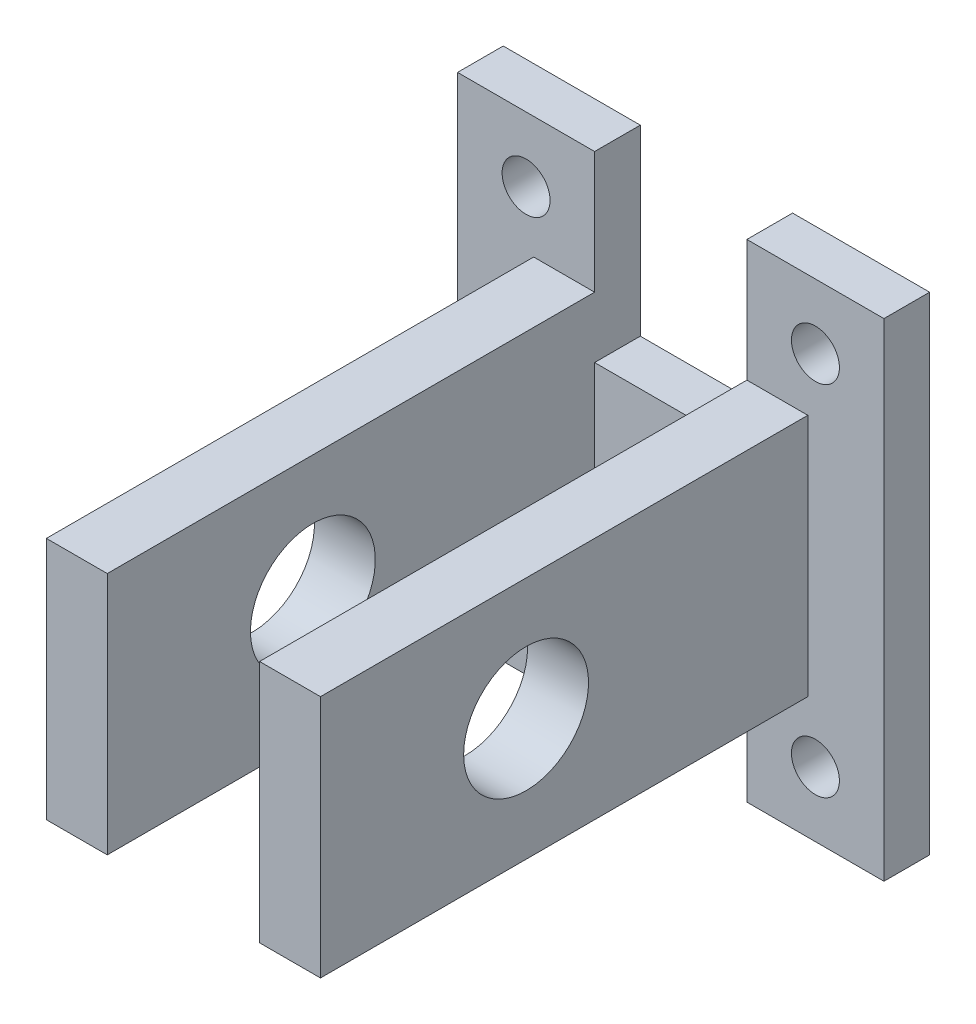
ISO-10303-21;
HEADER;
FILE_DESCRIPTION(('STEP AP214'),'2;1');
FILE_NAME('part.step','',(''),(''),'','','');
FILE_SCHEMA(('AUTOMOTIVE_DESIGN { 1 0 10303 214 1 1 1 1 }'));
ENDSEC;
DATA;
#1=APPLICATION_CONTEXT('core data for automotive mechanical design processes');
#2=APPLICATION_PROTOCOL_DEFINITION('international standard','automotive_design',2000,#1);
#3=PRODUCT_CONTEXT('',#1,'mechanical');
#4=PRODUCT('Part','Part','',(#3));
#5=PRODUCT_RELATED_PRODUCT_CATEGORY('part','',(#4));
#6=PRODUCT_DEFINITION_FORMATION('','',#4);
#7=PRODUCT_DEFINITION_CONTEXT('part definition',#1,'design');
#8=PRODUCT_DEFINITION('design','',#6,#7);
#9=PRODUCT_DEFINITION_SHAPE('','',#8);
#10=(LENGTH_UNIT() NAMED_UNIT(*) SI_UNIT(.MILLI.,.METRE.));
#11=(NAMED_UNIT(*) PLANE_ANGLE_UNIT() SI_UNIT($,.RADIAN.));
#12=(NAMED_UNIT(*) SI_UNIT($,.STERADIAN.) SOLID_ANGLE_UNIT());
#13=UNCERTAINTY_MEASURE_WITH_UNIT(LENGTH_MEASURE(1.E-05),#10,'distance_accuracy_value','');
#14=(GEOMETRIC_REPRESENTATION_CONTEXT(3) GLOBAL_UNCERTAINTY_ASSIGNED_CONTEXT((#13)) GLOBAL_UNIT_ASSIGNED_CONTEXT((#10,
#11,#12)) REPRESENTATION_CONTEXT('',''));
#15=CARTESIAN_POINT('',(0.,0.,0.));
#16=DIRECTION('',(0.,0.,1.));
#17=DIRECTION('',(1.,0.,0.));
#18=AXIS2_PLACEMENT_3D('',#15,#16,#17);
#19=CARTESIAN_POINT('',(0.,0.,3.));
#20=DIRECTION('',(0.,0.,-1.));
#21=DIRECTION('',(-1.,0.,0.));
#22=AXIS2_PLACEMENT_3D('',#19,#20,#21);
#23=PLANE('',#22);
#24=DIRECTION('',(0.,-1.,0.));
#25=VECTOR('',#24,1.);
#26=CARTESIAN_POINT('',(19.,8.,3.));
#27=LINE('',#26,#25);
#28=CARTESIAN_POINT('',(19.,20.,3.));
#29=VERTEX_POINT('',#28);
#30=CARTESIAN_POINT('',(19.,12.,3.));
#31=VERTEX_POINT('',#30);
#32=EDGE_CURVE('E358',#29,#31,#27,.T.);
#33=ORIENTED_EDGE('',*,*,#32,.F.);
#34=DIRECTION('',(-1.,0.,0.));
#35=VECTOR('',#34,1.);
#36=CARTESIAN_POINT('',(9.,20.,3.));
#37=LINE('',#36,#35);
#38=CARTESIAN_POINT('',(9.,20.,3.));
#39=VERTEX_POINT('',#38);
#40=EDGE_CURVE('E271',#29,#39,#37,.T.);
#41=ORIENTED_EDGE('',*,*,#40,.T.);
#42=DIRECTION('',(0.,1.,0.));
#43=VECTOR('',#42,1.);
#44=CARTESIAN_POINT('',(9.,8.,3.));
#45=LINE('',#44,#43);
#46=CARTESIAN_POINT('',(9.,12.,3.));
#47=VERTEX_POINT('',#46);
#48=EDGE_CURVE('E11',#47,#39,#45,.T.);
#49=ORIENTED_EDGE('',*,*,#48,.F.);
#50=DIRECTION('',(1.,0.,0.));
#51=VECTOR('',#50,1.);
#52=CARTESIAN_POINT('',(19.,12.,3.));
#53=LINE('',#52,#51);
#54=EDGE_CURVE('E260',#47,#31,#53,.T.);
#55=ORIENTED_EDGE('',*,*,#54,.T.);
#56=EDGE_LOOP('',(#33,#41,#49,#55));
#57=FACE_BOUND('',#56,.T.);
#58=ADVANCED_FACE('F33',(#57),#23,.F.);
#59=CARTESIAN_POINT('',(23.5,4.25,3.));
#60=DIRECTION('',(0.,0.,1.));
#61=DIRECTION('',(-1.,0.,0.));
#62=AXIS2_PLACEMENT_3D('',#59,#60,#61);
#63=CIRCLE('',#62,1.57500000000001);
#64=CARTESIAN_POINT('',(21.925,4.25,3.));
#65=VERTEX_POINT('',#64);
#66=EDGE_CURVE('E236',#65,#65,#63,.T.);
#67=ORIENTED_EDGE('',*,*,#66,.F.);
#68=EDGE_LOOP('',(#67));
#69=FACE_BOUND('',#68,.T.);
#70=CARTESIAN_POINT('',(23.5,27.75,3.));
#71=DIRECTION('',(0.,0.,1.));
#72=DIRECTION('',(-1.,0.,0.));
#73=AXIS2_PLACEMENT_3D('',#70,#71,#72);
#74=CIRCLE('',#73,1.575);
#75=CARTESIAN_POINT('',(21.925,27.75,3.));
#76=VERTEX_POINT('',#75);
#77=EDGE_CURVE('E230',#76,#76,#74,.T.);
#78=ORIENTED_EDGE('',*,*,#77,.F.);
#79=EDGE_LOOP('',(#78));
#80=FACE_BOUND('',#79,.T.);
#81=DIRECTION('',(1.,0.,0.));
#82=VECTOR('',#81,1.);
#83=CARTESIAN_POINT('',(23.,8.,3.));
#84=LINE('',#83,#82);
#85=CARTESIAN_POINT('',(19.,8.,3.));
#86=VERTEX_POINT('',#85);
#87=CARTESIAN_POINT('',(23.,8.,3.));
#88=VERTEX_POINT('',#87);
#89=EDGE_CURVE('E360',#86,#88,#84,.T.);
#90=ORIENTED_EDGE('',*,*,#89,.F.);
#91=DIRECTION('',(0.,-1.,0.));
#92=VECTOR('',#91,1.);
#93=CARTESIAN_POINT('',(19.,0.,3.));
#94=LINE('',#93,#92);
#95=CARTESIAN_POINT('',(19.,0.,3.));
#96=VERTEX_POINT('',#95);
#97=EDGE_CURVE('E193',#86,#96,#94,.T.);
#98=ORIENTED_EDGE('',*,*,#97,.T.);
#99=DIRECTION('',(1.,0.,0.));
#100=VECTOR('',#99,1.);
#101=CARTESIAN_POINT('',(28.,0.,3.));
#102=LINE('',#101,#100);
#103=CARTESIAN_POINT('',(28.,0.,3.));
#104=VERTEX_POINT('',#103);
#105=EDGE_CURVE('E263',#96,#104,#102,.T.);
#106=ORIENTED_EDGE('',*,*,#105,.T.);
#107=DIRECTION('',(0.,1.,0.));
#108=VECTOR('',#107,1.);
#109=CARTESIAN_POINT('',(28.,32.,3.));
#110=LINE('',#109,#108);
#111=CARTESIAN_POINT('',(28.,32.,3.));
#112=VERTEX_POINT('',#111);
#113=EDGE_CURVE('E265',#104,#112,#110,.T.);
#114=ORIENTED_EDGE('',*,*,#113,.T.);
#115=DIRECTION('',(-1.,0.,0.));
#116=VECTOR('',#115,1.);
#117=CARTESIAN_POINT('',(19.,32.,3.));
#118=LINE('',#117,#116);
#119=CARTESIAN_POINT('',(19.,32.,3.));
#120=VERTEX_POINT('',#119);
#121=EDGE_CURVE('E267',#112,#120,#118,.T.);
#122=ORIENTED_EDGE('',*,*,#121,.T.);
#123=DIRECTION('',(0.,-1.,0.));
#124=VECTOR('',#123,1.);
#125=CARTESIAN_POINT('',(19.,20.,3.));
#126=LINE('',#125,#124);
#127=CARTESIAN_POINT('',(19.,24.,3.));
#128=VERTEX_POINT('',#127);
#129=EDGE_CURVE('E269',#120,#128,#126,.T.);
#130=ORIENTED_EDGE('',*,*,#129,.T.);
#131=DIRECTION('',(-1.,0.,0.));
#132=VECTOR('',#131,1.);
#133=CARTESIAN_POINT('',(19.,24.,3.));
#134=LINE('',#133,#132);
#135=CARTESIAN_POINT('',(23.,24.,3.));
#136=VERTEX_POINT('',#135);
#137=EDGE_CURVE('E55',#136,#128,#134,.T.);
#138=ORIENTED_EDGE('',*,*,#137,.F.);
#139=DIRECTION('',(0.,1.,0.));
#140=VECTOR('',#139,1.);
#141=CARTESIAN_POINT('',(23.,24.,3.));
#142=LINE('',#141,#140);
#143=EDGE_CURVE('E50',#88,#136,#142,.T.);
#144=ORIENTED_EDGE('',*,*,#143,.F.);
#145=EDGE_LOOP('',(#90,#98,#106,#114,#122,#130,#138,#144));
#146=FACE_BOUND('',#145,.T.);
#147=ADVANCED_FACE('F411',(#69,#80,#146),#23,.F.);
#148=CARTESIAN_POINT('',(4.5,4.25,3.));
#149=DIRECTION('',(0.,0.,1.));
#150=DIRECTION('',(1.,0.,0.));
#151=AXIS2_PLACEMENT_3D('',#148,#149,#150);
#152=CIRCLE('',#151,1.575);
#153=CARTESIAN_POINT('',(6.075,4.25,3.));
#154=VERTEX_POINT('',#153);
#155=EDGE_CURVE('E242',#154,#154,#152,.T.);
#156=ORIENTED_EDGE('',*,*,#155,.F.);
#157=EDGE_LOOP('',(#156));
#158=FACE_BOUND('',#157,.T.);
#159=CARTESIAN_POINT('',(4.5,27.75,3.));
#160=DIRECTION('',(0.,0.,1.));
#161=DIRECTION('',(1.,0.,0.));
#162=AXIS2_PLACEMENT_3D('',#159,#160,#161);
#163=CIRCLE('',#162,1.575);
#164=CARTESIAN_POINT('',(6.075,27.75,3.));
#165=VERTEX_POINT('',#164);
#166=EDGE_CURVE('E248',#165,#165,#163,.T.);
#167=ORIENTED_EDGE('',*,*,#166,.F.);
#168=EDGE_LOOP('',(#167));
#169=FACE_BOUND('',#168,.T.);
#170=DIRECTION('',(1.,0.,0.));
#171=VECTOR('',#170,1.);
#172=CARTESIAN_POINT('',(5.,8.,3.));
#173=LINE('',#172,#171);
#174=CARTESIAN_POINT('',(5.,8.,3.));
#175=VERTEX_POINT('',#174);
#176=CARTESIAN_POINT('',(9.,8.,3.));
#177=VERTEX_POINT('',#176);
#178=EDGE_CURVE('E207',#175,#177,#173,.T.);
#179=ORIENTED_EDGE('',*,*,#178,.F.);
#180=DIRECTION('',(0.,-1.,0.));
#181=VECTOR('',#180,1.);
#182=CARTESIAN_POINT('',(5.,24.,3.));
#183=LINE('',#182,#181);
#184=CARTESIAN_POINT('',(5.,24.,3.));
#185=VERTEX_POINT('',#184);
#186=EDGE_CURVE('E197',#185,#175,#183,.T.);
#187=ORIENTED_EDGE('',*,*,#186,.F.);
#188=DIRECTION('',(-1.,0.,0.));
#189=VECTOR('',#188,1.);
#190=CARTESIAN_POINT('',(9.,24.,3.));
#191=LINE('',#190,#189);
#192=CARTESIAN_POINT('',(9.,24.,3.));
#193=VERTEX_POINT('',#192);
#194=EDGE_CURVE('E194',#193,#185,#191,.T.);
#195=ORIENTED_EDGE('',*,*,#194,.F.);
#196=DIRECTION('',(0.,1.,0.));
#197=VECTOR('',#196,1.);
#198=CARTESIAN_POINT('',(9.,32.,3.));
#199=LINE('',#198,#197);
#200=CARTESIAN_POINT('',(9.,32.,3.));
#201=VERTEX_POINT('',#200);
#202=EDGE_CURVE('E273',#193,#201,#199,.T.);
#203=ORIENTED_EDGE('',*,*,#202,.T.);
#204=DIRECTION('',(-1.,0.,0.));
#205=VECTOR('',#204,1.);
#206=CARTESIAN_POINT('',(0.,32.,3.));
#207=LINE('',#206,#205);
#208=CARTESIAN_POINT('',(0.,32.,3.));
#209=VERTEX_POINT('',#208);
#210=EDGE_CURVE('E275',#201,#209,#207,.T.);
#211=ORIENTED_EDGE('',*,*,#210,.T.);
#212=DIRECTION('',(0.,-1.,0.));
#213=VECTOR('',#212,1.);
#214=CARTESIAN_POINT('',(0.,0.,3.));
#215=LINE('',#214,#213);
#216=CARTESIAN_POINT('',(0.,0.,3.));
#217=VERTEX_POINT('',#216);
#218=EDGE_CURVE('E277',#209,#217,#215,.T.);
#219=ORIENTED_EDGE('',*,*,#218,.T.);
#220=DIRECTION('',(1.,0.,0.));
#221=VECTOR('',#220,1.);
#222=CARTESIAN_POINT('',(8.99999999999999,0.,3.));
#223=LINE('',#222,#221);
#224=CARTESIAN_POINT('',(8.99999999999999,0.,3.));
#225=VERTEX_POINT('',#224);
#226=EDGE_CURVE('E254',#217,#225,#223,.T.);
#227=ORIENTED_EDGE('',*,*,#226,.T.);
#228=DIRECTION('',(0.,1.,0.));
#229=VECTOR('',#228,1.);
#230=CARTESIAN_POINT('',(9.,12.,3.));
#231=LINE('',#230,#229);
#232=EDGE_CURVE('E257',#225,#177,#231,.T.);
#233=ORIENTED_EDGE('',*,*,#232,.T.);
#234=EDGE_LOOP('',(#179,#187,#195,#203,#211,#219,#227,#233));
#235=FACE_BOUND('',#234,.T.);
#236=ADVANCED_FACE('F413',(#158,#169,#235),#23,.F.);
#237=CARTESIAN_POINT('',(0.,0.,0.));
#238=DIRECTION('',(0.,0.,-1.));
#239=DIRECTION('',(-1.,0.,0.));
#240=AXIS2_PLACEMENT_3D('',#237,#238,#239);
#241=PLANE('',#240);
#242=CARTESIAN_POINT('',(23.5,4.25,0.));
#243=DIRECTION('',(0.,0.,1.));
#244=DIRECTION('',(-1.,0.,0.));
#245=AXIS2_PLACEMENT_3D('',#242,#243,#244);
#246=CIRCLE('',#245,1.57500000000001);
#247=CARTESIAN_POINT('',(21.925,4.25,0.));
#248=VERTEX_POINT('',#247);
#249=EDGE_CURVE('E233',#248,#248,#246,.T.);
#250=ORIENTED_EDGE('',*,*,#249,.T.);
#251=EDGE_LOOP('',(#250));
#252=FACE_BOUND('',#251,.T.);
#253=CARTESIAN_POINT('',(4.5,27.75,0.));
#254=DIRECTION('',(0.,0.,1.));
#255=DIRECTION('',(1.,0.,0.));
#256=AXIS2_PLACEMENT_3D('',#253,#254,#255);
#257=CIRCLE('',#256,1.575);
#258=CARTESIAN_POINT('',(6.075,27.75,0.));
#259=VERTEX_POINT('',#258);
#260=EDGE_CURVE('E245',#259,#259,#257,.T.);
#261=ORIENTED_EDGE('',*,*,#260,.T.);
#262=EDGE_LOOP('',(#261));
#263=FACE_BOUND('',#262,.T.);
#264=DIRECTION('',(1.,0.,0.));
#265=VECTOR('',#264,1.);
#266=CARTESIAN_POINT('',(8.99999999999999,0.,0.));
#267=LINE('',#266,#265);
#268=CARTESIAN_POINT('',(0.,0.,0.));
#269=VERTEX_POINT('',#268);
#270=CARTESIAN_POINT('',(8.99999999999999,0.,0.));
#271=VERTEX_POINT('',#270);
#272=EDGE_CURVE('E251',#269,#271,#267,.T.);
#273=ORIENTED_EDGE('',*,*,#272,.F.);
#274=DIRECTION('',(0.,-1.,0.));
#275=VECTOR('',#274,1.);
#276=CARTESIAN_POINT('',(0.,0.,0.));
#277=LINE('',#276,#275);
#278=CARTESIAN_POINT('',(0.,32.,0.));
#279=VERTEX_POINT('',#278);
#280=EDGE_CURVE('E258',#279,#269,#277,.T.);
#281=ORIENTED_EDGE('',*,*,#280,.F.);
#282=DIRECTION('',(-1.,0.,0.));
#283=VECTOR('',#282,1.);
#284=CARTESIAN_POINT('',(0.,32.,0.));
#285=LINE('',#284,#283);
#286=CARTESIAN_POINT('',(9.,32.,0.));
#287=VERTEX_POINT('',#286);
#288=EDGE_CURVE('E300',#287,#279,#285,.T.);
#289=ORIENTED_EDGE('',*,*,#288,.F.);
#290=DIRECTION('',(0.,1.,0.));
#291=VECTOR('',#290,1.);
#292=CARTESIAN_POINT('',(9.,32.,0.));
#293=LINE('',#292,#291);
#294=CARTESIAN_POINT('',(9.,20.,0.));
#295=VERTEX_POINT('',#294);
#296=EDGE_CURVE('E298',#295,#287,#293,.T.);
#297=ORIENTED_EDGE('',*,*,#296,.F.);
#298=DIRECTION('',(-1.,0.,0.));
#299=VECTOR('',#298,1.);
#300=CARTESIAN_POINT('',(9.,20.,0.));
#301=LINE('',#300,#299);
#302=CARTESIAN_POINT('',(19.,20.,0.));
#303=VERTEX_POINT('',#302);
#304=EDGE_CURVE('E296',#303,#295,#301,.T.);
#305=ORIENTED_EDGE('',*,*,#304,.F.);
#306=DIRECTION('',(0.,-1.,0.));
#307=VECTOR('',#306,1.);
#308=CARTESIAN_POINT('',(19.,20.,0.));
#309=LINE('',#308,#307);
#310=CARTESIAN_POINT('',(19.,32.,0.));
#311=VERTEX_POINT('',#310);
#312=EDGE_CURVE('E294',#311,#303,#309,.T.);
#313=ORIENTED_EDGE('',*,*,#312,.F.);
#314=DIRECTION('',(-1.,0.,0.));
#315=VECTOR('',#314,1.);
#316=CARTESIAN_POINT('',(19.,32.,0.));
#317=LINE('',#316,#315);
#318=CARTESIAN_POINT('',(28.,32.,0.));
#319=VERTEX_POINT('',#318);
#320=EDGE_CURVE('E292',#319,#311,#317,.T.);
#321=ORIENTED_EDGE('',*,*,#320,.F.);
#322=DIRECTION('',(0.,1.,0.));
#323=VECTOR('',#322,1.);
#324=CARTESIAN_POINT('',(28.,32.,0.));
#325=LINE('',#324,#323);
#326=CARTESIAN_POINT('',(28.,0.,0.));
#327=VERTEX_POINT('',#326);
#328=EDGE_CURVE('E290',#327,#319,#325,.T.);
#329=ORIENTED_EDGE('',*,*,#328,.F.);
#330=DIRECTION('',(1.,0.,0.));
#331=VECTOR('',#330,1.);
#332=CARTESIAN_POINT('',(28.,0.,0.));
#333=LINE('',#332,#331);
#334=CARTESIAN_POINT('',(19.,0.,0.));
#335=VERTEX_POINT('',#334);
#336=EDGE_CURVE('E288',#335,#327,#333,.T.);
#337=ORIENTED_EDGE('',*,*,#336,.F.);
#338=DIRECTION('',(0.,-1.,0.));
#339=VECTOR('',#338,1.);
#340=CARTESIAN_POINT('',(19.,0.,0.));
#341=LINE('',#340,#339);
#342=CARTESIAN_POINT('',(19.,12.,0.));
#343=VERTEX_POINT('',#342);
#344=EDGE_CURVE('E286',#343,#335,#341,.T.);
#345=ORIENTED_EDGE('',*,*,#344,.F.);
#346=DIRECTION('',(1.,0.,0.));
#347=VECTOR('',#346,1.);
#348=CARTESIAN_POINT('',(19.,12.,0.));
#349=LINE('',#348,#347);
#350=CARTESIAN_POINT('',(9.,12.,0.));
#351=VERTEX_POINT('',#350);
#352=EDGE_CURVE('E284',#351,#343,#349,.T.);
#353=ORIENTED_EDGE('',*,*,#352,.F.);
#354=DIRECTION('',(0.,1.,0.));
#355=VECTOR('',#354,1.);
#356=CARTESIAN_POINT('',(9.,12.,0.));
#357=LINE('',#356,#355);
#358=EDGE_CURVE('E282',#271,#351,#357,.T.);
#359=ORIENTED_EDGE('',*,*,#358,.F.);
#360=EDGE_LOOP('',(#273,#281,#289,#297,#305,#313,#321,#329,#337,#345,#353,#359));
#361=FACE_BOUND('',#360,.T.);
#362=CARTESIAN_POINT('',(4.5,4.25,0.));
#363=DIRECTION('',(0.,0.,1.));
#364=DIRECTION('',(1.,0.,0.));
#365=AXIS2_PLACEMENT_3D('',#362,#363,#364);
#366=CIRCLE('',#365,1.575);
#367=CARTESIAN_POINT('',(6.075,4.25,0.));
#368=VERTEX_POINT('',#367);
#369=EDGE_CURVE('E239',#368,#368,#366,.T.);
#370=ORIENTED_EDGE('',*,*,#369,.T.);
#371=EDGE_LOOP('',(#370));
#372=FACE_BOUND('',#371,.T.);
#373=CARTESIAN_POINT('',(23.5,27.75,0.));
#374=DIRECTION('',(0.,0.,1.));
#375=DIRECTION('',(-1.,0.,0.));
#376=AXIS2_PLACEMENT_3D('',#373,#374,#375);
#377=CIRCLE('',#376,1.575);
#378=CARTESIAN_POINT('',(21.925,27.75,0.));
#379=VERTEX_POINT('',#378);
#380=EDGE_CURVE('E229',#379,#379,#377,.T.);
#381=ORIENTED_EDGE('',*,*,#380,.T.);
#382=EDGE_LOOP('',(#381));
#383=FACE_BOUND('',#382,.T.);
#384=ADVANCED_FACE('F345',(#252,#263,#361,#372,#383),#241,.T.);
#385=CARTESIAN_POINT('',(8.99999999999999,0.,3.));
#386=DIRECTION('',(0.,1.,0.));
#387=DIRECTION('',(-1.,0.,0.));
#388=AXIS2_PLACEMENT_3D('',#385,#386,#387);
#389=PLANE('',#388);
#390=ORIENTED_EDGE('',*,*,#272,.T.);
#391=DIRECTION('',(0.,0.,-1.));
#392=VECTOR('',#391,1.);
#393=CARTESIAN_POINT('',(8.99999999999999,0.,3.));
#394=LINE('',#393,#392);
#395=EDGE_CURVE('E42',#225,#271,#394,.T.);
#396=ORIENTED_EDGE('',*,*,#395,.F.);
#397=ORIENTED_EDGE('',*,*,#226,.F.);
#398=DIRECTION('',(0.,0.,-1.));
#399=VECTOR('',#398,1.);
#400=CARTESIAN_POINT('',(0.,0.,3.));
#401=LINE('',#400,#399);
#402=EDGE_CURVE('E279',#217,#269,#401,.T.);
#403=ORIENTED_EDGE('',*,*,#402,.T.);
#404=EDGE_LOOP('',(#390,#396,#397,#403));
#405=FACE_BOUND('',#404,.T.);
#406=ADVANCED_FACE('F35',(#405),#389,.F.);
#407=CARTESIAN_POINT('',(19.,12.,3.));
#408=DIRECTION('',(0.,1.,0.));
#409=DIRECTION('',(-1.,0.,0.));
#410=AXIS2_PLACEMENT_3D('',#407,#408,#409);
#411=PLANE('',#410);
#412=ORIENTED_EDGE('',*,*,#352,.T.);
#413=DIRECTION('',(0.,0.,-1.));
#414=VECTOR('',#413,1.);
#415=CARTESIAN_POINT('',(19.,12.,3.));
#416=LINE('',#415,#414);
#417=EDGE_CURVE('E329',#31,#343,#416,.T.);
#418=ORIENTED_EDGE('',*,*,#417,.F.);
#419=ORIENTED_EDGE('',*,*,#54,.F.);
#420=DIRECTION('',(0.,0.,-1.));
#421=VECTOR('',#420,1.);
#422=CARTESIAN_POINT('',(9.,12.,3.));
#423=LINE('',#422,#421);
#424=EDGE_CURVE('E332',#47,#351,#423,.T.);
#425=ORIENTED_EDGE('',*,*,#424,.T.);
#426=EDGE_LOOP('',(#412,#418,#419,#425));
#427=FACE_BOUND('',#426,.T.);
#428=ADVANCED_FACE('F353',(#427),#411,.F.);
#429=CARTESIAN_POINT('',(28.,0.,3.));
#430=DIRECTION('',(0.,1.,0.));
#431=DIRECTION('',(0.,0.,1.));
#432=AXIS2_PLACEMENT_3D('',#429,#430,#431);
#433=PLANE('',#432);
#434=ORIENTED_EDGE('',*,*,#336,.T.);
#435=DIRECTION('',(0.,0.,-1.));
#436=VECTOR('',#435,1.);
#437=CARTESIAN_POINT('',(28.,0.,3.));
#438=LINE('',#437,#436);
#439=EDGE_CURVE('E323',#104,#327,#438,.T.);
#440=ORIENTED_EDGE('',*,*,#439,.F.);
#441=ORIENTED_EDGE('',*,*,#105,.F.);
#442=DIRECTION('',(0.,0.,-1.));
#443=VECTOR('',#442,1.);
#444=CARTESIAN_POINT('',(19.,0.,3.));
#445=LINE('',#444,#443);
#446=EDGE_CURVE('E326',#96,#335,#445,.T.);
#447=ORIENTED_EDGE('',*,*,#446,.T.);
#448=EDGE_LOOP('',(#434,#440,#441,#447));
#449=FACE_BOUND('',#448,.T.);
#450=ADVANCED_FACE('F619',(#449),#433,.F.);
#451=CARTESIAN_POINT('',(28.,32.,3.));
#452=DIRECTION('',(-1.,0.,0.));
#453=DIRECTION('',(0.,-1.,0.));
#454=AXIS2_PLACEMENT_3D('',#451,#452,#453);
#455=PLANE('',#454);
#456=ORIENTED_EDGE('',*,*,#328,.T.);
#457=DIRECTION('',(0.,0.,-1.));
#458=VECTOR('',#457,1.);
#459=CARTESIAN_POINT('',(28.,32.,3.));
#460=LINE('',#459,#458);
#461=EDGE_CURVE('E320',#112,#319,#460,.T.);
#462=ORIENTED_EDGE('',*,*,#461,.F.);
#463=ORIENTED_EDGE('',*,*,#113,.F.);
#464=ORIENTED_EDGE('',*,*,#439,.T.);
#465=EDGE_LOOP('',(#456,#462,#463,#464));
#466=FACE_BOUND('',#465,.T.);
#467=ADVANCED_FACE('F407',(#466),#455,.F.);
#468=CARTESIAN_POINT('',(19.,32.,3.));
#469=DIRECTION('',(0.,-1.,0.));
#470=DIRECTION('',(0.,0.,-1.));
#471=AXIS2_PLACEMENT_3D('',#468,#469,#470);
#472=PLANE('',#471);
#473=ORIENTED_EDGE('',*,*,#320,.T.);
#474=DIRECTION('',(0.,0.,-1.));
#475=VECTOR('',#474,1.);
#476=CARTESIAN_POINT('',(19.,32.,3.));
#477=LINE('',#476,#475);
#478=EDGE_CURVE('E317',#120,#311,#477,.T.);
#479=ORIENTED_EDGE('',*,*,#478,.F.);
#480=ORIENTED_EDGE('',*,*,#121,.F.);
#481=ORIENTED_EDGE('',*,*,#461,.T.);
#482=EDGE_LOOP('',(#473,#479,#480,#481));
#483=FACE_BOUND('',#482,.T.);
#484=ADVANCED_FACE('F399',(#483),#472,.F.);
#485=CARTESIAN_POINT('',(19.,20.,3.));
#486=DIRECTION('',(1.,0.,0.));
#487=DIRECTION('',(0.,0.,-1.));
#488=AXIS2_PLACEMENT_3D('',#485,#486,#487);
#489=PLANE('',#488);
#490=CARTESIAN_POINT('',(19.,16.,21.5));
#491=DIRECTION('',(1.,0.,0.));
#492=DIRECTION('',(0.,0.,-1.));
#493=AXIS2_PLACEMENT_3D('',#490,#491,#492);
#494=CIRCLE('',#493,4.1);
#495=CARTESIAN_POINT('',(19.,16.,17.4));
#496=VERTEX_POINT('',#495);
#497=EDGE_CURVE('E361',#496,#496,#494,.T.);
#498=ORIENTED_EDGE('',*,*,#497,.T.);
#499=EDGE_LOOP('',(#498));
#500=FACE_BOUND('',#499,.T.);
#501=ORIENTED_EDGE('',*,*,#312,.T.);
#502=DIRECTION('',(0.,0.,-1.));
#503=VECTOR('',#502,1.);
#504=CARTESIAN_POINT('',(19.,20.,3.));
#505=LINE('',#504,#503);
#506=EDGE_CURVE('E314',#29,#303,#505,.T.);
#507=ORIENTED_EDGE('',*,*,#506,.F.);
#508=ORIENTED_EDGE('',*,*,#32,.T.);
#509=ORIENTED_EDGE('',*,*,#417,.T.);
#510=ORIENTED_EDGE('',*,*,#344,.T.);
#511=ORIENTED_EDGE('',*,*,#446,.F.);
#512=ORIENTED_EDGE('',*,*,#97,.F.);
#513=DIRECTION('',(0.,0.,-1.));
#514=VECTOR('',#513,1.);
#515=CARTESIAN_POINT('',(19.,8.,35.));
#516=LINE('',#515,#514);
#517=CARTESIAN_POINT('',(19.,8.,35.));
#518=VERTEX_POINT('',#517);
#519=EDGE_CURVE('E174',#518,#86,#516,.T.);
#520=ORIENTED_EDGE('',*,*,#519,.F.);
#521=DIRECTION('',(0.,-1.,0.));
#522=VECTOR('',#521,1.);
#523=CARTESIAN_POINT('',(19.,8.,35.));
#524=LINE('',#523,#522);
#525=CARTESIAN_POINT('',(19.,24.,35.));
#526=VERTEX_POINT('',#525);
#527=EDGE_CURVE('E180',#526,#518,#524,.T.);
#528=ORIENTED_EDGE('',*,*,#527,.F.);
#529=DIRECTION('',(0.,0.,-1.));
#530=VECTOR('',#529,1.);
#531=CARTESIAN_POINT('',(19.,24.,35.));
#532=LINE('',#531,#530);
#533=EDGE_CURVE('E372',#526,#128,#532,.T.);
#534=ORIENTED_EDGE('',*,*,#533,.T.);
#535=ORIENTED_EDGE('',*,*,#129,.F.);
#536=ORIENTED_EDGE('',*,*,#478,.T.);
#537=EDGE_LOOP('',(#501,#507,#508,#509,#510,#511,#512,#520,#528,#534,#535,#536));
#538=FACE_BOUND('',#537,.T.);
#539=ADVANCED_FACE('F191',(#500,#538),#489,.F.);
#540=CARTESIAN_POINT('',(9.,20.,3.));
#541=DIRECTION('',(0.,-1.,0.));
#542=DIRECTION('',(1.,0.,0.));
#543=AXIS2_PLACEMENT_3D('',#540,#541,#542);
#544=PLANE('',#543);
#545=ORIENTED_EDGE('',*,*,#304,.T.);
#546=DIRECTION('',(0.,0.,-1.));
#547=VECTOR('',#546,1.);
#548=CARTESIAN_POINT('',(9.,20.,3.));
#549=LINE('',#548,#547);
#550=EDGE_CURVE('E311',#39,#295,#549,.T.);
#551=ORIENTED_EDGE('',*,*,#550,.F.);
#552=ORIENTED_EDGE('',*,*,#40,.F.);
#553=ORIENTED_EDGE('',*,*,#506,.T.);
#554=EDGE_LOOP('',(#545,#551,#552,#553));
#555=FACE_BOUND('',#554,.T.);
#556=ADVANCED_FACE('F398',(#555),#544,.F.);
#557=CARTESIAN_POINT('',(9.,32.,3.));
#558=DIRECTION('',(-1.,0.,0.));
#559=DIRECTION('',(0.,0.,1.));
#560=AXIS2_PLACEMENT_3D('',#557,#558,#559);
#561=PLANE('',#560);
#562=CARTESIAN_POINT('',(9.,16.,21.5));
#563=DIRECTION('',(-1.,0.,0.));
#564=DIRECTION('',(0.,0.,1.));
#565=AXIS2_PLACEMENT_3D('',#562,#563,#564);
#566=CIRCLE('',#565,4.1);
#567=CARTESIAN_POINT('',(9.,16.,25.6));
#568=VERTEX_POINT('',#567);
#569=EDGE_CURVE('E365',#568,#568,#566,.T.);
#570=ORIENTED_EDGE('',*,*,#569,.T.);
#571=EDGE_LOOP('',(#570));
#572=FACE_BOUND('',#571,.T.);
#573=ORIENTED_EDGE('',*,*,#296,.T.);
#574=DIRECTION('',(0.,0.,-1.));
#575=VECTOR('',#574,1.);
#576=CARTESIAN_POINT('',(9.,32.,3.));
#577=LINE('',#576,#575);
#578=EDGE_CURVE('E308',#201,#287,#577,.T.);
#579=ORIENTED_EDGE('',*,*,#578,.F.);
#580=ORIENTED_EDGE('',*,*,#202,.F.);
#581=DIRECTION('',(0.,0.,-1.));
#582=VECTOR('',#581,1.);
#583=CARTESIAN_POINT('',(9.,24.,35.));
#584=LINE('',#583,#582);
#585=CARTESIAN_POINT('',(9.,24.,35.));
#586=VERTEX_POINT('',#585);
#587=EDGE_CURVE('E226',#586,#193,#584,.T.);
#588=ORIENTED_EDGE('',*,*,#587,.F.);
#589=DIRECTION('',(0.,1.,0.));
#590=VECTOR('',#589,1.);
#591=CARTESIAN_POINT('',(9.,8.,35.));
#592=LINE('',#591,#590);
#593=CARTESIAN_POINT('',(9.,8.,35.));
#594=VERTEX_POINT('',#593);
#595=EDGE_CURVE('E203',#594,#586,#592,.T.);
#596=ORIENTED_EDGE('',*,*,#595,.F.);
#597=DIRECTION('',(0.,0.,-1.));
#598=VECTOR('',#597,1.);
#599=CARTESIAN_POINT('',(9.,8.,35.));
#600=LINE('',#599,#598);
#601=EDGE_CURVE('E212',#594,#177,#600,.T.);
#602=ORIENTED_EDGE('',*,*,#601,.T.);
#603=ORIENTED_EDGE('',*,*,#232,.F.);
#604=ORIENTED_EDGE('',*,*,#395,.T.);
#605=ORIENTED_EDGE('',*,*,#358,.T.);
#606=ORIENTED_EDGE('',*,*,#424,.F.);
#607=ORIENTED_EDGE('',*,*,#48,.T.);
#608=ORIENTED_EDGE('',*,*,#550,.T.);
#609=EDGE_LOOP('',(#573,#579,#580,#588,#596,#602,#603,#604,#605,#606,#607,#608));
#610=FACE_BOUND('',#609,.T.);
#611=ADVANCED_FACE('F337',(#572,#610),#561,.F.);
#612=CARTESIAN_POINT('',(0.,32.,3.));
#613=DIRECTION('',(0.,-1.,0.));
#614=DIRECTION('',(0.,0.,-1.));
#615=AXIS2_PLACEMENT_3D('',#612,#613,#614);
#616=PLANE('',#615);
#617=ORIENTED_EDGE('',*,*,#288,.T.);
#618=DIRECTION('',(0.,0.,-1.));
#619=VECTOR('',#618,1.);
#620=CARTESIAN_POINT('',(0.,32.,3.));
#621=LINE('',#620,#619);
#622=EDGE_CURVE('E305',#209,#279,#621,.T.);
#623=ORIENTED_EDGE('',*,*,#622,.F.);
#624=ORIENTED_EDGE('',*,*,#210,.F.);
#625=ORIENTED_EDGE('',*,*,#578,.T.);
#626=EDGE_LOOP('',(#617,#623,#624,#625));
#627=FACE_BOUND('',#626,.T.);
#628=ADVANCED_FACE('F451',(#627),#616,.F.);
#629=CARTESIAN_POINT('',(0.,0.,3.));
#630=DIRECTION('',(1.,0.,0.));
#631=DIRECTION('',(0.,0.,-1.));
#632=AXIS2_PLACEMENT_3D('',#629,#630,#631);
#633=PLANE('',#632);
#634=ORIENTED_EDGE('',*,*,#280,.T.);
#635=ORIENTED_EDGE('',*,*,#402,.F.);
#636=ORIENTED_EDGE('',*,*,#218,.F.);
#637=ORIENTED_EDGE('',*,*,#622,.T.);
#638=EDGE_LOOP('',(#634,#635,#636,#637));
#639=FACE_BOUND('',#638,.T.);
#640=ADVANCED_FACE('F454',(#639),#633,.F.);
#641=CARTESIAN_POINT('',(4.5,27.75,3.));
#642=DIRECTION('',(0.,0.,-1.));
#643=DIRECTION('',(-1.,0.,0.));
#644=AXIS2_PLACEMENT_3D('',#641,#642,#643);
#645=CYLINDRICAL_SURFACE('',#644,1.575);
#646=ORIENTED_EDGE('',*,*,#166,.T.);
#647=EDGE_LOOP('',(#646));
#648=FACE_BOUND('',#647,.T.);
#649=ORIENTED_EDGE('',*,*,#260,.F.);
#650=EDGE_LOOP('',(#649));
#651=FACE_BOUND('',#650,.T.);
#652=ADVANCED_FACE('F456',(#648,#651),#645,.F.);
#653=CARTESIAN_POINT('',(4.5,4.25,3.));
#654=DIRECTION('',(0.,0.,-1.));
#655=DIRECTION('',(-1.,0.,0.));
#656=AXIS2_PLACEMENT_3D('',#653,#654,#655);
#657=CYLINDRICAL_SURFACE('',#656,1.575);
#658=ORIENTED_EDGE('',*,*,#155,.T.);
#659=EDGE_LOOP('',(#658));
#660=FACE_BOUND('',#659,.T.);
#661=ORIENTED_EDGE('',*,*,#369,.F.);
#662=EDGE_LOOP('',(#661));
#663=FACE_BOUND('',#662,.T.);
#664=ADVANCED_FACE('F462',(#660,#663),#657,.F.);
#665=CARTESIAN_POINT('',(23.5,4.25,3.));
#666=DIRECTION('',(0.,0.,-1.));
#667=DIRECTION('',(-1.,0.,0.));
#668=AXIS2_PLACEMENT_3D('',#665,#666,#667);
#669=CYLINDRICAL_SURFACE('',#668,1.57500000000001);
#670=ORIENTED_EDGE('',*,*,#66,.T.);
#671=EDGE_LOOP('',(#670));
#672=FACE_BOUND('',#671,.T.);
#673=ORIENTED_EDGE('',*,*,#249,.F.);
#674=EDGE_LOOP('',(#673));
#675=FACE_BOUND('',#674,.T.);
#676=ADVANCED_FACE('F496',(#672,#675),#669,.F.);
#677=CARTESIAN_POINT('',(23.5,27.75,3.));
#678=DIRECTION('',(0.,0.,-1.));
#679=DIRECTION('',(-1.,0.,0.));
#680=AXIS2_PLACEMENT_3D('',#677,#678,#679);
#681=CYLINDRICAL_SURFACE('',#680,1.575);
#682=ORIENTED_EDGE('',*,*,#77,.T.);
#683=EDGE_LOOP('',(#682));
#684=FACE_BOUND('',#683,.T.);
#685=ORIENTED_EDGE('',*,*,#380,.F.);
#686=EDGE_LOOP('',(#685));
#687=FACE_BOUND('',#686,.T.);
#688=ADVANCED_FACE('F493',(#684,#687),#681,.F.);
#689=CARTESIAN_POINT('',(9.,24.,35.));
#690=DIRECTION('',(0.,-1.,0.));
#691=DIRECTION('',(1.,0.,0.));
#692=AXIS2_PLACEMENT_3D('',#689,#690,#691);
#693=PLANE('',#692);
#694=ORIENTED_EDGE('',*,*,#194,.T.);
#695=DIRECTION('',(0.,0.,-1.));
#696=VECTOR('',#695,1.);
#697=CARTESIAN_POINT('',(5.,24.,35.));
#698=LINE('',#697,#696);
#699=CARTESIAN_POINT('',(5.,24.,35.));
#700=VERTEX_POINT('',#699);
#701=EDGE_CURVE('E223',#700,#185,#698,.T.);
#702=ORIENTED_EDGE('',*,*,#701,.F.);
#703=DIRECTION('',(-1.,0.,0.));
#704=VECTOR('',#703,1.);
#705=CARTESIAN_POINT('',(9.,24.,35.));
#706=LINE('',#705,#704);
#707=EDGE_CURVE('E206',#586,#700,#706,.T.);
#708=ORIENTED_EDGE('',*,*,#707,.F.);
#709=ORIENTED_EDGE('',*,*,#587,.T.);
#710=EDGE_LOOP('',(#694,#702,#708,#709));
#711=FACE_BOUND('',#710,.T.);
#712=ADVANCED_FACE('F444',(#711),#693,.F.);
#713=CARTESIAN_POINT('',(5.,24.,35.));
#714=DIRECTION('',(1.,0.,0.));
#715=DIRECTION('',(0.,0.,-1.));
#716=AXIS2_PLACEMENT_3D('',#713,#714,#715);
#717=PLANE('',#716);
#718=CARTESIAN_POINT('',(5.,16.,21.5));
#719=DIRECTION('',(-1.,0.,0.));
#720=DIRECTION('',(0.,0.,1.));
#721=AXIS2_PLACEMENT_3D('',#718,#719,#720);
#722=CIRCLE('',#721,4.1);
#723=CARTESIAN_POINT('',(5.,16.,25.6));
#724=VERTEX_POINT('',#723);
#725=EDGE_CURVE('E382',#724,#724,#722,.T.);
#726=ORIENTED_EDGE('',*,*,#725,.F.);
#727=EDGE_LOOP('',(#726));
#728=FACE_BOUND('',#727,.T.);
#729=ORIENTED_EDGE('',*,*,#186,.T.);
#730=DIRECTION('',(0.,0.,-1.));
#731=VECTOR('',#730,1.);
#732=CARTESIAN_POINT('',(5.,8.,35.));
#733=LINE('',#732,#731);
#734=CARTESIAN_POINT('',(5.,8.,35.));
#735=VERTEX_POINT('',#734);
#736=EDGE_CURVE('E220',#735,#175,#733,.T.);
#737=ORIENTED_EDGE('',*,*,#736,.F.);
#738=DIRECTION('',(0.,-1.,0.));
#739=VECTOR('',#738,1.);
#740=CARTESIAN_POINT('',(5.,24.,35.));
#741=LINE('',#740,#739);
#742=EDGE_CURVE('E209',#700,#735,#741,.T.);
#743=ORIENTED_EDGE('',*,*,#742,.F.);
#744=ORIENTED_EDGE('',*,*,#701,.T.);
#745=EDGE_LOOP('',(#729,#737,#743,#744));
#746=FACE_BOUND('',#745,.T.);
#747=ADVANCED_FACE('F434',(#728,#746),#717,.F.);
#748=CARTESIAN_POINT('',(5.,8.,35.));
#749=DIRECTION('',(0.,1.,0.));
#750=DIRECTION('',(-1.,0.,0.));
#751=AXIS2_PLACEMENT_3D('',#748,#749,#750);
#752=PLANE('',#751);
#753=ORIENTED_EDGE('',*,*,#178,.T.);
#754=ORIENTED_EDGE('',*,*,#601,.F.);
#755=DIRECTION('',(1.,0.,0.));
#756=VECTOR('',#755,1.);
#757=CARTESIAN_POINT('',(5.,8.,35.));
#758=LINE('',#757,#756);
#759=EDGE_CURVE('E211',#735,#594,#758,.T.);
#760=ORIENTED_EDGE('',*,*,#759,.F.);
#761=ORIENTED_EDGE('',*,*,#736,.T.);
#762=EDGE_LOOP('',(#753,#754,#760,#761));
#763=FACE_BOUND('',#762,.T.);
#764=ADVANCED_FACE('F438',(#763),#752,.F.);
#765=CARTESIAN_POINT('',(0.,0.,35.));
#766=DIRECTION('',(0.,0.,1.));
#767=DIRECTION('',(1.,0.,0.));
#768=AXIS2_PLACEMENT_3D('',#765,#766,#767);
#769=PLANE('',#768);
#770=ORIENTED_EDGE('',*,*,#595,.T.);
#771=ORIENTED_EDGE('',*,*,#707,.T.);
#772=ORIENTED_EDGE('',*,*,#742,.T.);
#773=ORIENTED_EDGE('',*,*,#759,.T.);
#774=EDGE_LOOP('',(#770,#771,#772,#773));
#775=FACE_BOUND('',#774,.T.);
#776=ADVANCED_FACE('F441',(#775),#769,.T.);
#777=CARTESIAN_POINT('',(23.,8.,35.));
#778=DIRECTION('',(0.,1.,0.));
#779=DIRECTION('',(0.,0.,1.));
#780=AXIS2_PLACEMENT_3D('',#777,#778,#779);
#781=PLANE('',#780);
#782=ORIENTED_EDGE('',*,*,#89,.T.);
#783=DIRECTION('',(0.,0.,-1.));
#784=VECTOR('',#783,1.);
#785=CARTESIAN_POINT('',(23.,8.,35.));
#786=LINE('',#785,#784);
#787=CARTESIAN_POINT('',(23.,8.,35.));
#788=VERTEX_POINT('',#787);
#789=EDGE_CURVE('E176',#788,#88,#786,.T.);
#790=ORIENTED_EDGE('',*,*,#789,.F.);
#791=DIRECTION('',(1.,0.,0.));
#792=VECTOR('',#791,1.);
#793=CARTESIAN_POINT('',(23.,8.,35.));
#794=LINE('',#793,#792);
#795=EDGE_CURVE('E170',#518,#788,#794,.T.);
#796=ORIENTED_EDGE('',*,*,#795,.F.);
#797=ORIENTED_EDGE('',*,*,#519,.T.);
#798=EDGE_LOOP('',(#782,#790,#796,#797));
#799=FACE_BOUND('',#798,.T.);
#800=ADVANCED_FACE('F172',(#799),#781,.F.);
#801=CARTESIAN_POINT('',(23.,24.,35.));
#802=DIRECTION('',(-1.,0.,0.));
#803=DIRECTION('',(0.,0.,1.));
#804=AXIS2_PLACEMENT_3D('',#801,#802,#803);
#805=PLANE('',#804);
#806=CARTESIAN_POINT('',(23.,16.,21.5));
#807=DIRECTION('',(-1.,0.,0.));
#808=DIRECTION('',(0.,0.,1.));
#809=AXIS2_PLACEMENT_3D('',#806,#807,#808);
#810=CIRCLE('',#809,4.1);
#811=CARTESIAN_POINT('',(23.,16.,25.6));
#812=VERTEX_POINT('',#811);
#813=EDGE_CURVE('E37',#812,#812,#810,.T.);
#814=ORIENTED_EDGE('',*,*,#813,.T.);
#815=EDGE_LOOP('',(#814));
#816=FACE_BOUND('',#815,.T.);
#817=ORIENTED_EDGE('',*,*,#143,.T.);
#818=DIRECTION('',(0.,0.,-1.));
#819=VECTOR('',#818,1.);
#820=CARTESIAN_POINT('',(23.,24.,35.));
#821=LINE('',#820,#819);
#822=CARTESIAN_POINT('',(23.,24.,35.));
#823=VERTEX_POINT('',#822);
#824=EDGE_CURVE('E199',#823,#136,#821,.T.);
#825=ORIENTED_EDGE('',*,*,#824,.F.);
#826=DIRECTION('',(0.,1.,0.));
#827=VECTOR('',#826,1.);
#828=CARTESIAN_POINT('',(23.,24.,35.));
#829=LINE('',#828,#827);
#830=EDGE_CURVE('E179',#788,#823,#829,.T.);
#831=ORIENTED_EDGE('',*,*,#830,.F.);
#832=ORIENTED_EDGE('',*,*,#789,.T.);
#833=EDGE_LOOP('',(#817,#825,#831,#832));
#834=FACE_BOUND('',#833,.T.);
#835=ADVANCED_FACE('F378',(#816,#834),#805,.F.);
#836=CARTESIAN_POINT('',(19.,24.,35.));
#837=DIRECTION('',(0.,-1.,0.));
#838=DIRECTION('',(0.,0.,-1.));
#839=AXIS2_PLACEMENT_3D('',#836,#837,#838);
#840=PLANE('',#839);
#841=ORIENTED_EDGE('',*,*,#137,.T.);
#842=ORIENTED_EDGE('',*,*,#533,.F.);
#843=DIRECTION('',(-1.,0.,0.));
#844=VECTOR('',#843,1.);
#845=CARTESIAN_POINT('',(19.,24.,35.));
#846=LINE('',#845,#844);
#847=EDGE_CURVE('E185',#823,#526,#846,.T.);
#848=ORIENTED_EDGE('',*,*,#847,.F.);
#849=ORIENTED_EDGE('',*,*,#824,.T.);
#850=EDGE_LOOP('',(#841,#842,#848,#849));
#851=FACE_BOUND('',#850,.T.);
#852=ADVANCED_FACE('F376',(#851),#840,.F.);
#853=CARTESIAN_POINT('',(0.,0.,35.));
#854=DIRECTION('',(0.,0.,-1.));
#855=DIRECTION('',(-1.,0.,0.));
#856=AXIS2_PLACEMENT_3D('',#853,#854,#855);
#857=PLANE('',#856);
#858=ORIENTED_EDGE('',*,*,#527,.T.);
#859=ORIENTED_EDGE('',*,*,#795,.T.);
#860=ORIENTED_EDGE('',*,*,#830,.T.);
#861=ORIENTED_EDGE('',*,*,#847,.T.);
#862=EDGE_LOOP('',(#858,#859,#860,#861));
#863=FACE_BOUND('',#862,.T.);
#864=ADVANCED_FACE('F183',(#863),#857,.F.);
#865=CARTESIAN_POINT('',(40.,16.,21.5));
#866=DIRECTION('',(-1.,0.,0.));
#867=DIRECTION('',(0.,0.,1.));
#868=AXIS2_PLACEMENT_3D('',#865,#866,#867);
#869=CYLINDRICAL_SURFACE('',#868,4.1);
#870=ORIENTED_EDGE('',*,*,#813,.F.);
#871=EDGE_LOOP('',(#870));
#872=FACE_BOUND('',#871,.T.);
#873=ORIENTED_EDGE('',*,*,#497,.F.);
#874=EDGE_LOOP('',(#873));
#875=FACE_BOUND('',#874,.T.);
#876=ADVANCED_FACE('F390',(#872,#875),#869,.F.);
#877=ORIENTED_EDGE('',*,*,#725,.T.);
#878=EDGE_LOOP('',(#877));
#879=FACE_BOUND('',#878,.T.);
#880=ORIENTED_EDGE('',*,*,#569,.F.);
#881=EDGE_LOOP('',(#880));
#882=FACE_BOUND('',#881,.T.);
#883=ADVANCED_FACE('F393',(#879,#882),#869,.F.);
#884=CLOSED_SHELL('',(#58,#147,#236,#384,#406,#428,#450,#467,#484,#539,#556,#611,#628,#640,#652,
#664,#676,#688,#712,#747,#764,#776,#800,#835,#852,#864,#876,#883));
#885=MANIFOLD_SOLID_BREP('B2',#884);
#886=ADVANCED_BREP_SHAPE_REPRESENTATION('',(#18,#885),#14);
#887=SHAPE_DEFINITION_REPRESENTATION(#9,#886);
ENDSEC;
END-ISO-10303-21;
